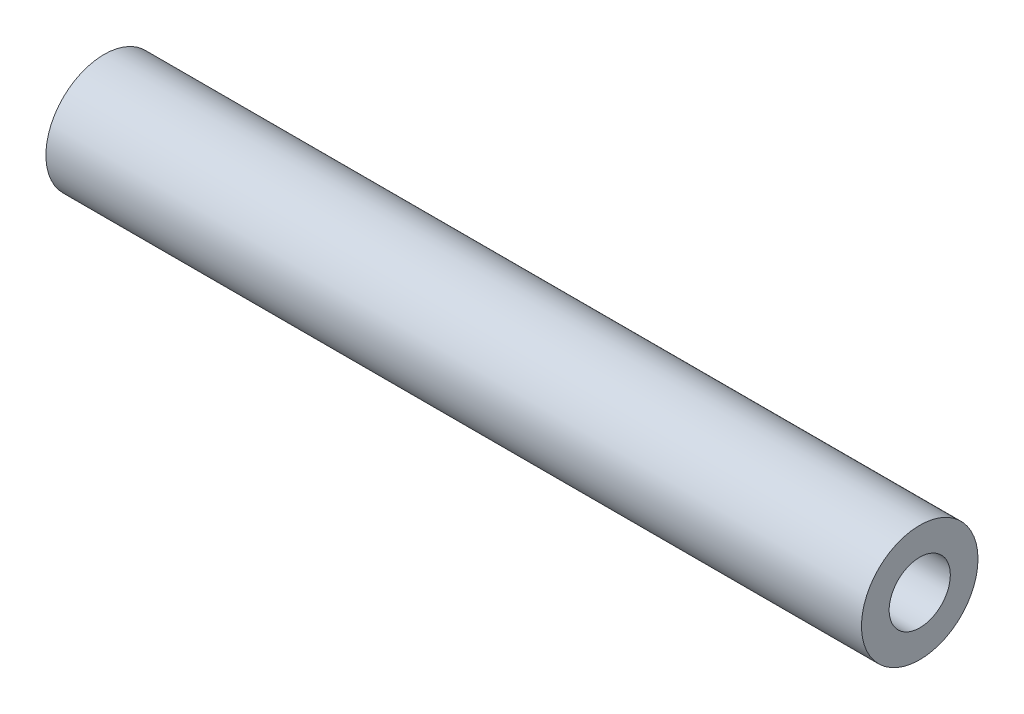
ISO-10303-21;
HEADER;
FILE_DESCRIPTION(('STEP AP214'),'2;1');
FILE_NAME('part.step','',(''),(''),'','','');
FILE_SCHEMA(('AUTOMOTIVE_DESIGN { 1 0 10303 214 1 1 1 1 }'));
ENDSEC;
DATA;
#1=APPLICATION_CONTEXT('core data for automotive mechanical design processes');
#2=APPLICATION_PROTOCOL_DEFINITION('international standard','automotive_design',2000,#1);
#3=PRODUCT_CONTEXT('',#1,'mechanical');
#4=PRODUCT('Part','Part','',(#3));
#5=PRODUCT_RELATED_PRODUCT_CATEGORY('part','',(#4));
#6=PRODUCT_DEFINITION_FORMATION('','',#4);
#7=PRODUCT_DEFINITION_CONTEXT('part definition',#1,'design');
#8=PRODUCT_DEFINITION('design','',#6,#7);
#9=PRODUCT_DEFINITION_SHAPE('','',#8);
#10=(LENGTH_UNIT() NAMED_UNIT(*) SI_UNIT(.MILLI.,.METRE.));
#11=(NAMED_UNIT(*) PLANE_ANGLE_UNIT() SI_UNIT($,.RADIAN.));
#12=(NAMED_UNIT(*) SI_UNIT($,.STERADIAN.) SOLID_ANGLE_UNIT());
#13=UNCERTAINTY_MEASURE_WITH_UNIT(LENGTH_MEASURE(1.E-05),#10,'distance_accuracy_value','');
#14=(GEOMETRIC_REPRESENTATION_CONTEXT(3) GLOBAL_UNCERTAINTY_ASSIGNED_CONTEXT((#13)) GLOBAL_UNIT_ASSIGNED_CONTEXT((#10,
#11,#12)) REPRESENTATION_CONTEXT('',''));
#15=CARTESIAN_POINT('',(0.,0.,0.));
#16=DIRECTION('',(0.,0.,1.));
#17=DIRECTION('',(1.,0.,0.));
#18=AXIS2_PLACEMENT_3D('',#15,#16,#17);
#19=CARTESIAN_POINT('',(56.,0.,0.));
#20=DIRECTION('',(1.,0.,0.));
#21=DIRECTION('',(0.,0.,-1.));
#22=AXIS2_PLACEMENT_3D('',#19,#20,#21);
#23=PLANE('',#22);
#24=CARTESIAN_POINT('',(56.,0.,0.));
#25=DIRECTION('',(1.,0.,0.));
#26=DIRECTION('',(0.,0.,-1.));
#27=AXIS2_PLACEMENT_3D('',#24,#25,#26);
#28=CIRCLE('',#27,4.);
#29=CARTESIAN_POINT('',(56.,0.,-4.));
#30=VERTEX_POINT('',#29);
#31=EDGE_CURVE('E10',#30,#30,#28,.T.);
#32=ORIENTED_EDGE('',*,*,#31,.T.);
#33=EDGE_LOOP('',(#32));
#34=FACE_BOUND('',#33,.T.);
#35=CARTESIAN_POINT('',(56.,0.,0.));
#36=DIRECTION('',(1.,0.,0.));
#37=DIRECTION('',(0.,0.,-1.));
#38=AXIS2_PLACEMENT_3D('',#35,#36,#37);
#39=CIRCLE('',#38,2.1);
#40=CARTESIAN_POINT('',(56.,0.,-2.1));
#41=VERTEX_POINT('',#40);
#42=EDGE_CURVE('E52',#41,#41,#39,.T.);
#43=ORIENTED_EDGE('',*,*,#42,.F.);
#44=EDGE_LOOP('',(#43));
#45=FACE_BOUND('',#44,.T.);
#46=ADVANCED_FACE('F41',(#34,#45),#23,.T.);
#47=CARTESIAN_POINT('',(0.,0.,0.));
#48=DIRECTION('',(1.,0.,0.));
#49=DIRECTION('',(0.,0.,-1.));
#50=AXIS2_PLACEMENT_3D('',#47,#48,#49);
#51=PLANE('',#50);
#52=CARTESIAN_POINT('',(0.,0.,0.));
#53=DIRECTION('',(1.,0.,0.));
#54=DIRECTION('',(0.,0.,-1.));
#55=AXIS2_PLACEMENT_3D('',#52,#53,#54);
#56=CIRCLE('',#55,4.);
#57=CARTESIAN_POINT('',(0.,0.,-4.));
#58=VERTEX_POINT('',#57);
#59=EDGE_CURVE('E45',#58,#58,#56,.T.);
#60=ORIENTED_EDGE('',*,*,#59,.F.);
#61=EDGE_LOOP('',(#60));
#62=FACE_BOUND('',#61,.T.);
#63=CARTESIAN_POINT('',(0.,0.,0.));
#64=DIRECTION('',(1.,0.,0.));
#65=DIRECTION('',(0.,0.,-1.));
#66=AXIS2_PLACEMENT_3D('',#63,#64,#65);
#67=CIRCLE('',#66,2.1);
#68=CARTESIAN_POINT('',(0.,0.,-2.1));
#69=VERTEX_POINT('',#68);
#70=EDGE_CURVE('E54',#69,#69,#67,.T.);
#71=ORIENTED_EDGE('',*,*,#70,.T.);
#72=EDGE_LOOP('',(#71));
#73=FACE_BOUND('',#72,.T.);
#74=ADVANCED_FACE('F64',(#62,#73),#51,.F.);
#75=CARTESIAN_POINT('',(56.,0.,0.));
#76=DIRECTION('',(-1.,0.,0.));
#77=DIRECTION('',(0.,0.,1.));
#78=AXIS2_PLACEMENT_3D('',#75,#76,#77);
#79=CYLINDRICAL_SURFACE('',#78,4.);
#80=ORIENTED_EDGE('',*,*,#31,.F.);
#81=EDGE_LOOP('',(#80));
#82=FACE_BOUND('',#81,.T.);
#83=ORIENTED_EDGE('',*,*,#59,.T.);
#84=EDGE_LOOP('',(#83));
#85=FACE_BOUND('',#84,.T.);
#86=ADVANCED_FACE('F43',(#82,#85),#79,.T.);
#87=CARTESIAN_POINT('',(56.,0.,0.));
#88=DIRECTION('',(-1.,0.,0.));
#89=DIRECTION('',(0.,0.,1.));
#90=AXIS2_PLACEMENT_3D('',#87,#88,#89);
#91=CYLINDRICAL_SURFACE('',#90,2.1);
#92=ORIENTED_EDGE('',*,*,#42,.T.);
#93=EDGE_LOOP('',(#92));
#94=FACE_BOUND('',#93,.T.);
#95=ORIENTED_EDGE('',*,*,#70,.F.);
#96=EDGE_LOOP('',(#95));
#97=FACE_BOUND('',#96,.T.);
#98=ADVANCED_FACE('F60',(#94,#97),#91,.F.);
#99=CLOSED_SHELL('',(#46,#74,#86,#98));
#100=MANIFOLD_SOLID_BREP('B2',#99);
#101=ADVANCED_BREP_SHAPE_REPRESENTATION('',(#18,#100),#14);
#102=SHAPE_DEFINITION_REPRESENTATION(#9,#101);
ENDSEC;
END-ISO-10303-21;
